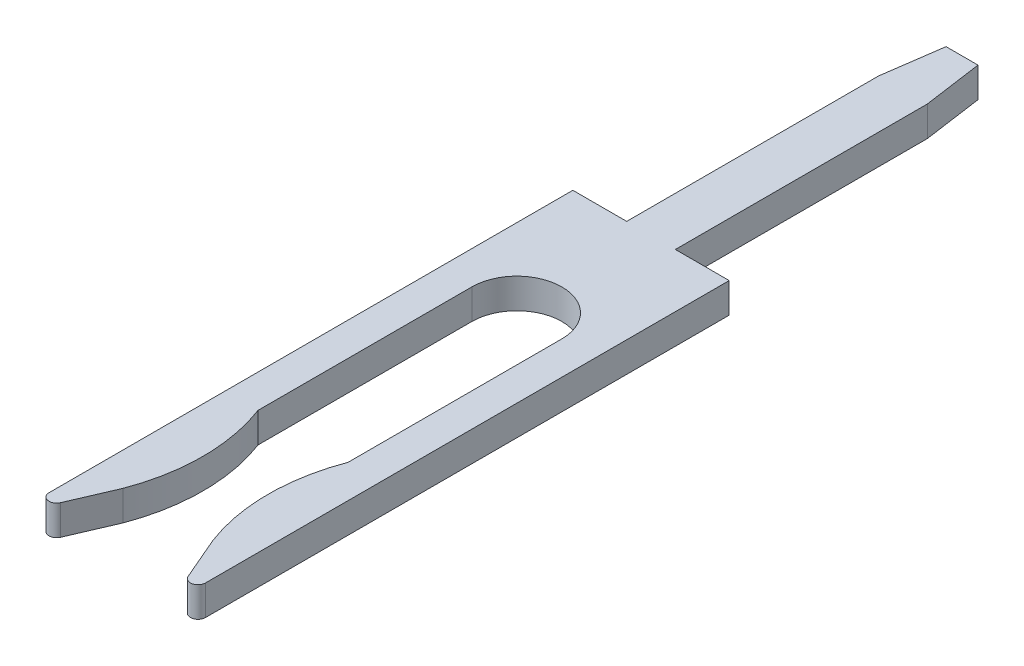
ISO-10303-21;
HEADER;
FILE_DESCRIPTION(('STEP AP214'),'2;1');
FILE_NAME('part.step','',(''),(''),'','','');
FILE_SCHEMA(('AUTOMOTIVE_DESIGN { 1 0 10303 214 1 1 1 1 }'));
ENDSEC;
DATA;
#1=APPLICATION_CONTEXT('core data for automotive mechanical design processes');
#2=APPLICATION_PROTOCOL_DEFINITION('international standard','automotive_design',2000,#1);
#3=PRODUCT_CONTEXT('',#1,'mechanical');
#4=PRODUCT('Part','Part','',(#3));
#5=PRODUCT_RELATED_PRODUCT_CATEGORY('part','',(#4));
#6=PRODUCT_DEFINITION_FORMATION('','',#4);
#7=PRODUCT_DEFINITION_CONTEXT('part definition',#1,'design');
#8=PRODUCT_DEFINITION('design','',#6,#7);
#9=PRODUCT_DEFINITION_SHAPE('','',#8);
#10=(LENGTH_UNIT() NAMED_UNIT(*) SI_UNIT(.MILLI.,.METRE.));
#11=(NAMED_UNIT(*) PLANE_ANGLE_UNIT() SI_UNIT($,.RADIAN.));
#12=(NAMED_UNIT(*) SI_UNIT($,.STERADIAN.) SOLID_ANGLE_UNIT());
#13=UNCERTAINTY_MEASURE_WITH_UNIT(LENGTH_MEASURE(1.E-05),#10,'distance_accuracy_value','');
#14=(GEOMETRIC_REPRESENTATION_CONTEXT(3) GLOBAL_UNCERTAINTY_ASSIGNED_CONTEXT((#13)) GLOBAL_UNIT_ASSIGNED_CONTEXT((#10,
#11,#12)) REPRESENTATION_CONTEXT('',''));
#15=CARTESIAN_POINT('',(0.,0.,0.));
#16=DIRECTION('',(0.,0.,1.));
#17=DIRECTION('',(1.,0.,0.));
#18=AXIS2_PLACEMENT_3D('',#15,#16,#17);
#19=CARTESIAN_POINT('',(25.07599652433,25.28989998217,6.080777376405));
#20=DIRECTION('',(-1.,-1.19248806385E-08,0.));
#21=DIRECTION('',(-1.19248806385E-08,1.,0.));
#22=AXIS2_PLACEMENT_3D('',#19,#20,#21);
#23=PLANE('',#22);
#24=DIRECTION('',(1.19499143889812E-08,-1.,4.37363856211066E-08));
#25=VECTOR('',#24,1.);
#26=CARTESIAN_POINT('',(25.07599652434,25.28990013485,9.573270968314));
#27=LINE('',#26,#25);
#28=CARTESIAN_POINT('',(25.07599652433,25.28990013484,9.573270968304));
#29=VERTEX_POINT('',#28);
#30=CARTESIAN_POINT('',(25.0759965291,24.88990013484,9.573270985789));
#31=VERTEX_POINT('',#30);
#32=EDGE_CURVE('E40',#29,#31,#27,.T.);
#33=ORIENTED_EDGE('',*,*,#32,.F.);
#34=DIRECTION('',(0.,-4.37128426212911E-08,-1.));
#35=VECTOR('',#34,1.);
#36=CARTESIAN_POINT('',(25.07599652434,25.28990013485,9.573270968314));
#37=LINE('',#36,#35);
#38=CARTESIAN_POINT('',(25.07599652433,25.28989982951,2.588283784507));
#39=VERTEX_POINT('',#38);
#40=EDGE_CURVE('E11',#29,#39,#37,.T.);
#41=ORIENTED_EDGE('',*,*,#40,.T.);
#42=DIRECTION('',(-1.19499143889812E-08,1.,-4.37364056051265E-08));
#43=VECTOR('',#42,1.);
#44=CARTESIAN_POINT('',(25.07599652911,24.88989982952,2.588283802001));
#45=LINE('',#44,#43);
#46=CARTESIAN_POINT('',(25.0759965291,24.88989982951,2.588283801991));
#47=VERTEX_POINT('',#46);
#48=EDGE_CURVE('E221',#47,#39,#45,.T.);
#49=ORIENTED_EDGE('',*,*,#48,.F.);
#50=DIRECTION('',(0.,-4.37128426212911E-08,-1.));
#51=VECTOR('',#50,1.);
#52=CARTESIAN_POINT('',(25.07599652911,24.88990013485,9.573270985799));
#53=LINE('',#52,#51);
#54=EDGE_CURVE('E278',#31,#47,#53,.T.);
#55=ORIENTED_EDGE('',*,*,#54,.F.);
#56=EDGE_LOOP('',(#33,#41,#49,#55));
#57=FACE_BOUND('',#56,.T.);
#58=ADVANCED_FACE('F17',(#57),#23,.T.);
#59=CARTESIAN_POINT('',(26.11879998724,24.88989981555,1.984306391413));
#60=DIRECTION('',(1.19248806385E-08,-1.,4.371140955657E-08));
#61=DIRECTION('',(-1.,-1.19248806385E-08,0.));
#62=AXIS2_PLACEMENT_3D('',#59,#60,#61);
#63=PLANE('',#62);
#64=DIRECTION('',(1.,1.19387949569543E-08,0.));
#65=VECTOR('',#64,1.);
#66=CARTESIAN_POINT('',(25.07599652911,24.88989982952,2.588283802001));
#67=LINE('',#66,#65);
#68=CARTESIAN_POINT('',(25.7943303603,24.88989983808,2.588283801991));
#69=VERTEX_POINT('',#68);
#70=EDGE_CURVE('E28',#47,#69,#67,.T.);
#71=ORIENTED_EDGE('',*,*,#70,.T.);
#72=DIRECTION('',(0.,-4.37143894959307E-08,-1.));
#73=VECTOR('',#72,1.);
#74=CARTESIAN_POINT('',(25.79433036031,24.88989983809,2.588283802001));
#75=LINE('',#74,#73);
#76=CARTESIAN_POINT('',(25.7943303603,24.88989969122,-0.7713859140081));
#77=VERTEX_POINT('',#76);
#78=EDGE_CURVE('E315',#69,#77,#75,.T.);
#79=ORIENTED_EDGE('',*,*,#78,.T.);
#80=DIRECTION('',(0.140037219781573,-4.16233468669388E-08,-0.990146240247291));
#81=VECTOR('',#80,1.);
#82=CARTESIAN_POINT('',(25.79433036031,24.88989969123,-0.7713859140181));
#83=LINE('',#82,#81);
#84=CARTESIAN_POINT('',(25.90579998724,24.8898996581,-1.559542321246));
#85=VERTEX_POINT('',#84);
#86=EDGE_CURVE('E319',#77,#85,#83,.T.);
#87=ORIENTED_EDGE('',*,*,#86,.T.);
#88=DIRECTION('',(1.,1.19483577939033E-08,0.));
#89=VECTOR('',#88,1.);
#90=CARTESIAN_POINT('',(25.90579998725,24.88989965811,-1.559542321256));
#91=LINE('',#90,#89);
#92=CARTESIAN_POINT('',(26.33179998724,24.88989966318,-1.559542321246));
#93=VERTEX_POINT('',#92);
#94=EDGE_CURVE('E327',#85,#93,#91,.T.);
#95=ORIENTED_EDGE('',*,*,#94,.T.);
#96=DIRECTION('',(0.140037219781671,4.49631833702907E-08,0.990146240247277));
#97=VECTOR('',#96,1.);
#98=CARTESIAN_POINT('',(26.33179998725,24.88989966319,-1.559542321256));
#99=LINE('',#98,#97);
#100=CARTESIAN_POINT('',(26.44326961418,24.88989969896,-0.7713859140083));
#101=VERTEX_POINT('',#100);
#102=EDGE_CURVE('E240',#93,#101,#99,.T.);
#103=ORIENTED_EDGE('',*,*,#102,.T.);
#104=DIRECTION('',(0.,4.37143916108408E-08,1.));
#105=VECTOR('',#104,1.);
#106=CARTESIAN_POINT('',(26.44326961419,24.88989969897,-0.7713859140183));
#107=LINE('',#106,#105);
#108=CARTESIAN_POINT('',(26.44326961418,24.88989984582,2.588283801991));
#109=VERTEX_POINT('',#108);
#110=EDGE_CURVE('E236',#101,#109,#107,.T.);
#111=ORIENTED_EDGE('',*,*,#110,.T.);
#112=DIRECTION('',(1.,1.19388147400343E-08,0.));
#113=VECTOR('',#112,1.);
#114=CARTESIAN_POINT('',(26.44326961419,24.88989984583,2.588283802001));
#115=LINE('',#114,#113);
#116=CARTESIAN_POINT('',(27.16160344538,24.88989985438,2.588283801991));
#117=VERTEX_POINT('',#116);
#118=EDGE_CURVE('E209',#109,#117,#115,.T.);
#119=ORIENTED_EDGE('',*,*,#118,.T.);
#120=DIRECTION('',(0.,4.37128385523211E-08,1.));
#121=VECTOR('',#120,1.);
#122=CARTESIAN_POINT('',(27.16160344539,24.88989985439,2.588283802001));
#123=LINE('',#122,#121);
#124=CARTESIAN_POINT('',(27.16160344538,24.88990015971,9.573270985789));
#125=VERTEX_POINT('',#124);
#126=EDGE_CURVE('E205',#117,#125,#123,.T.);
#127=ORIENTED_EDGE('',*,*,#126,.T.);
#128=CARTESIAN_POINT('',(27.06160344539,24.88990015852,9.573270985799));
#129=DIRECTION('',(1.20248966201232E-08,-1.,4.38114095533913E-08));
#130=DIRECTION('',(1.,1.20248966245075E-08,1.00071054263569E-10));
#131=AXIS2_PLACEMENT_3D('',#128,#129,#130);
#132=CIRCLE('',#131,0.10000000001);
#133=CARTESIAN_POINT('',(26.96975880725,24.88990015915,9.612825536045));
#134=VERTEX_POINT('',#133);
#135=EDGE_CURVE('E210',#125,#134,#132,.T.);
#136=ORIENTED_EDGE('',*,*,#135,.T.);
#137=DIRECTION('',(-0.395545502570568,-4.48791955093043E-08,-0.918446381339811));
#138=VECTOR('',#137,1.);
#139=CARTESIAN_POINT('',(26.96975880726,24.88990015916,9.612825536055));
#140=LINE('',#139,#138);
#141=CARTESIAN_POINT('',(26.71911315898,24.88990013072,9.03083285213));
#142=VERTEX_POINT('',#141);
#143=EDGE_CURVE('E251',#134,#142,#140,.T.);
#144=ORIENTED_EDGE('',*,*,#143,.T.);
#145=CARTESIAN_POINT('',(29.10159490395,24.88990011976,8.129959697596));
#146=DIRECTION('',(1.19225969347574E-08,-1.,4.37164703831067E-08));
#147=DIRECTION('',(-0.935365037457716,4.30982804777045E-09,0.353683823070445));
#148=AXIS2_PLACEMENT_3D('',#145,#146,#147);
#149=CIRCLE('',#148,2.54711438802489);
#150=CARTESIAN_POINT('',(26.71911315898,24.88990005196,7.229086543042));
#151=VERTEX_POINT('',#150);
#152=EDGE_CURVE('E247',#142,#151,#149,.T.);
#153=ORIENTED_EDGE('',*,*,#152,.T.);
#154=DIRECTION('',(0.,-4.371491727807E-08,-1.));
#155=VECTOR('',#154,1.);
#156=CARTESIAN_POINT('',(26.71911315899,24.88990005197,7.229086543052));
#157=LINE('',#156,#155);
#158=CARTESIAN_POINT('',(26.71911315898,24.88989992732,4.377666423637));
#159=VERTEX_POINT('',#158);
#160=EDGE_CURVE('E252',#151,#159,#157,.T.);
#161=ORIENTED_EDGE('',*,*,#160,.T.);
#162=CARTESIAN_POINT('',(26.11879998725,24.88989992017,4.377666423647));
#163=DIRECTION('',(-1.19415357801803E-08,1.,-4.37280675276324E-08));
#164=DIRECTION('',(1.,1.19415357794208E-08,-1.73681440488589E-11));
#165=AXIS2_PLACEMENT_3D('',#162,#163,#164);
#166=CIRCLE('',#165,0.6003131717543);
#167=CARTESIAN_POINT('',(25.5184868155,24.88989991301,4.377666423637));
#168=VERTEX_POINT('',#167);
#169=EDGE_CURVE('E181',#159,#168,#166,.T.);
#170=ORIENTED_EDGE('',*,*,#169,.T.);
#171=DIRECTION('',(0.,4.371492226186E-08,1.));
#172=VECTOR('',#171,1.);
#173=CARTESIAN_POINT('',(25.51848681551,24.88989991302,4.377666423647));
#174=LINE('',#173,#172);
#175=CARTESIAN_POINT('',(25.5184868155,24.88990003765,7.229086543042));
#176=VERTEX_POINT('',#175);
#177=EDGE_CURVE('E161',#168,#176,#174,.T.);
#178=ORIENTED_EDGE('',*,*,#177,.T.);
#179=CARTESIAN_POINT('',(23.13600507055,24.88990004862,8.129959697596));
#180=DIRECTION('',(1.19225969347481E-08,-1.,4.37164703831103E-08));
#181=DIRECTION('',(0.935365037457795,-4.30982804777035E-09,-0.353683823070237));
#182=AXIS2_PLACEMENT_3D('',#179,#180,#181);
#183=CIRCLE('',#182,2.54711438802489);
#184=CARTESIAN_POINT('',(25.5184868155,24.8899001164,9.03083285213));
#185=VERTEX_POINT('',#184);
#186=EDGE_CURVE('E168',#176,#185,#183,.T.);
#187=ORIENTED_EDGE('',*,*,#186,.T.);
#188=DIRECTION('',(-0.395545502570568,3.54455188138302E-08,0.918446381339812));
#189=VECTOR('',#188,1.);
#190=CARTESIAN_POINT('',(25.51848681551,24.88990011641,9.03083285214));
#191=LINE('',#190,#189);
#192=CARTESIAN_POINT('',(25.26784116723,24.88990013885,9.612825536045));
#193=VERTEX_POINT('',#192);
#194=EDGE_CURVE('E176',#185,#193,#191,.T.);
#195=ORIENTED_EDGE('',*,*,#194,.T.);
#196=CARTESIAN_POINT('',(25.17599652911,24.88990013604,9.573270985799));
#197=DIRECTION('',(1.19771811966332E-08,-1.,4.38428132506953E-08));
#198=DIRECTION('',(0.918446381322305,2.83422263316255E-08,0.395545502611221));
#199=AXIS2_PLACEMENT_3D('',#196,#197,#198);
#200=CIRCLE('',#199,0.10000000001314);
#201=EDGE_CURVE('E282',#193,#31,#200,.T.);
#202=ORIENTED_EDGE('',*,*,#201,.T.);
#203=ORIENTED_EDGE('',*,*,#54,.T.);
#204=EDGE_LOOP('',(#71,#79,#87,#95,#103,#111,#119,#127,#136,#144,#153,#161,#170,#178,#187,#195,
#202,#203));
#205=FACE_BOUND('',#204,.T.);
#206=ADVANCED_FACE('F179',(#205),#63,.T.);
#207=CARTESIAN_POINT('',(25.17599652433,25.28990013603,9.573270968304));
#208=DIRECTION('',(1.19248806385E-08,-1.,4.371140955657E-08));
#209=DIRECTION('',(1.,1.19248806385E-08,0.));
#210=AXIS2_PLACEMENT_3D('',#207,#208,#209);
#211=CYLINDRICAL_SURFACE('',#210,0.1);
#212=DIRECTION('',(-1.19499232707712E-08,1.,-4.37364078255666E-08));
#213=VECTOR('',#212,1.);
#214=CARTESIAN_POINT('',(25.26784116724,24.88990013886,9.612825536055));
#215=LINE('',#214,#213);
#216=CARTESIAN_POINT('',(25.26784116246,25.28990013885,9.612825518561));
#217=VERTEX_POINT('',#216);
#218=EDGE_CURVE('E283',#193,#217,#215,.T.);
#219=ORIENTED_EDGE('',*,*,#218,.T.);
#220=CARTESIAN_POINT('',(25.17599652434,25.28990013604,9.573270968314));
#221=DIRECTION('',(-1.20248966288933E-08,1.,-4.38114095509863E-08));
#222=DIRECTION('',(-1.,-1.20248966245075E-08,1.00106581400353E-10));
#223=AXIS2_PLACEMENT_3D('',#220,#221,#222);
#224=CIRCLE('',#223,0.10000000001);
#225=EDGE_CURVE('E201',#29,#217,#224,.T.);
#226=ORIENTED_EDGE('',*,*,#225,.F.);
#227=ORIENTED_EDGE('',*,*,#32,.T.);
#228=ORIENTED_EDGE('',*,*,#201,.F.);
#229=EDGE_LOOP('',(#219,#226,#227,#228));
#230=FACE_BOUND('',#229,.T.);
#231=ADVANCED_FACE('F442',(#230),#211,.T.);
#232=CARTESIAN_POINT('',(26.11879998247,25.28989981555,1.984306373928));
#233=DIRECTION('',(1.19248806385E-08,-1.,4.371140955657E-08));
#234=DIRECTION('',(-1.,-1.19248806385E-08,0.));
#235=AXIS2_PLACEMENT_3D('',#232,#233,#234);
#236=PLANE('',#235);
#237=ORIENTED_EDGE('',*,*,#40,.F.);
#238=ORIENTED_EDGE('',*,*,#225,.T.);
#239=DIRECTION('',(0.395545502570568,-3.54455244203702E-08,-0.918446381339812));
#240=VECTOR('',#239,1.);
#241=CARTESIAN_POINT('',(25.26784116247,25.28990013886,9.612825518571));
#242=LINE('',#241,#240);
#243=CARTESIAN_POINT('',(25.51848681073,25.2899001164,9.030832834645));
#244=VERTEX_POINT('',#243);
#245=EDGE_CURVE('E204',#217,#244,#242,.T.);
#246=ORIENTED_EDGE('',*,*,#245,.T.);
#247=CARTESIAN_POINT('',(23.13600506578,25.28990004862,8.129959680111));
#248=DIRECTION('',(-1.19271638080785E-08,1.,-4.37164701812266E-08));
#249=DIRECTION('',(0.935365037457827,2.66180603269375E-08,0.35368382307015));
#250=AXIS2_PLACEMENT_3D('',#247,#248,#249);
#251=CIRCLE('',#250,2.54711438802489);
#252=CARTESIAN_POINT('',(25.51848681073,25.28990003765,7.229086525558));
#253=VERTEX_POINT('',#252);
#254=EDGE_CURVE('E215',#244,#253,#251,.T.);
#255=ORIENTED_EDGE('',*,*,#254,.T.);
#256=DIRECTION('',(0.,4.371492226185E-08,1.));
#257=VECTOR('',#256,1.);
#258=CARTESIAN_POINT('',(25.51848681074,25.28989991302,4.377666406163));
#259=LINE('',#258,#257);
#260=CARTESIAN_POINT('',(25.51848681073,25.28989991301,4.377666406153));
#261=VERTEX_POINT('',#260);
#262=EDGE_CURVE('E187',#261,#253,#259,.T.);
#263=ORIENTED_EDGE('',*,*,#262,.F.);
#264=CARTESIAN_POINT('',(26.11879998248,25.28989992017,4.377666406163));
#265=DIRECTION('',(1.19415357786599E-08,-1.,4.37280675280302E-08));
#266=DIRECTION('',(-1.,-1.19415357794208E-08,-1.74006936015804E-11));
#267=AXIS2_PLACEMENT_3D('',#264,#265,#266);
#268=CIRCLE('',#267,0.6003131717543);
#269=CARTESIAN_POINT('',(26.71911315421,25.28989992732,4.377666406153));
#270=VERTEX_POINT('',#269);
#271=EDGE_CURVE('E211',#261,#270,#268,.T.);
#272=ORIENTED_EDGE('',*,*,#271,.T.);
#273=DIRECTION('',(0.,-4.371491603213E-08,-1.));
#274=VECTOR('',#273,1.);
#275=CARTESIAN_POINT('',(26.71911315422,25.28990005197,7.229086525567));
#276=LINE('',#275,#274);
#277=CARTESIAN_POINT('',(26.71911315421,25.28990005196,7.229086525557));
#278=VERTEX_POINT('',#277);
#279=EDGE_CURVE('E256',#278,#270,#276,.T.);
#280=ORIENTED_EDGE('',*,*,#279,.F.);
#281=CARTESIAN_POINT('',(29.10159489918,25.28990011976,8.129959680111));
#282=DIRECTION('',(-1.19271638080703E-08,1.,-4.37164701812235E-08));
#283=DIRECTION('',(-0.935365037457761,-2.66180603269356E-08,-0.353683823070325));
#284=AXIS2_PLACEMENT_3D('',#281,#282,#283);
#285=CIRCLE('',#284,2.54711438802489);
#286=CARTESIAN_POINT('',(26.71911315421,25.28990013072,9.030832834645));
#287=VERTEX_POINT('',#286);
#288=EDGE_CURVE('E216',#278,#287,#285,.T.);
#289=ORIENTED_EDGE('',*,*,#288,.T.);
#290=DIRECTION('',(0.395545502570568,4.48791842961643E-08,0.918446381339811));
#291=VECTOR('',#290,1.);
#292=CARTESIAN_POINT('',(26.71911315422,25.28990013073,9.030832834655));
#293=LINE('',#292,#291);
#294=CARTESIAN_POINT('',(26.96975880248,25.28990015915,9.612825518561));
#295=VERTEX_POINT('',#294);
#296=EDGE_CURVE('E220',#287,#295,#293,.T.);
#297=ORIENTED_EDGE('',*,*,#296,.T.);
#298=CARTESIAN_POINT('',(27.06160344062,25.28990015852,9.573270968314));
#299=DIRECTION('',(-1.18726045316643E-08,1.,-4.38428027177064E-08));
#300=DIRECTION('',(-0.918446381321739,6.43747276794627E-09,0.395545502612535));
#301=AXIS2_PLACEMENT_3D('',#298,#299,#300);
#302=CIRCLE('',#301,0.10000000001314);
#303=CARTESIAN_POINT('',(27.16160344061,25.28990015971,9.573270968304));
#304=VERTEX_POINT('',#303);
#305=EDGE_CURVE('E229',#295,#304,#302,.T.);
#306=ORIENTED_EDGE('',*,*,#305,.T.);
#307=DIRECTION('',(0.,4.37128380437011E-08,1.));
#308=VECTOR('',#307,1.);
#309=CARTESIAN_POINT('',(27.16160344062,25.28989985439,2.588283784517));
#310=LINE('',#309,#308);
#311=CARTESIAN_POINT('',(27.16160344061,25.28989985438,2.588283784507));
#312=VERTEX_POINT('',#311);
#313=EDGE_CURVE('E230',#312,#304,#310,.T.);
#314=ORIENTED_EDGE('',*,*,#313,.F.);
#315=DIRECTION('',(1.,1.19388048484943E-08,0.));
#316=VECTOR('',#315,1.);
#317=CARTESIAN_POINT('',(26.44326960942,25.28989984583,2.588283784517));
#318=LINE('',#317,#316);
#319=CARTESIAN_POINT('',(26.44326960941,25.28989984582,2.588283784507));
#320=VERTEX_POINT('',#319);
#321=EDGE_CURVE('E323',#320,#312,#318,.T.);
#322=ORIENTED_EDGE('',*,*,#321,.F.);
#323=DIRECTION('',(0.,4.37143926683008E-08,1.));
#324=VECTOR('',#323,1.);
#325=CARTESIAN_POINT('',(26.44326960942,25.28989969897,-0.7713859315028));
#326=LINE('',#325,#324);
#327=CARTESIAN_POINT('',(26.44326960941,25.28989969896,-0.7713859314928));
#328=VERTEX_POINT('',#327);
#329=EDGE_CURVE('E273',#328,#320,#326,.T.);
#330=ORIENTED_EDGE('',*,*,#329,.F.);
#331=DIRECTION('',(-0.140037219781671,-4.49631878335007E-08,-0.990146240247277));
#332=VECTOR('',#331,1.);
#333=CARTESIAN_POINT('',(26.44326960942,25.28989969897,-0.7713859315028));
#334=LINE('',#333,#332);
#335=CARTESIAN_POINT('',(26.33179998247,25.28989966318,-1.559542338731));
#336=VERTEX_POINT('',#335);
#337=EDGE_CURVE('E289',#328,#336,#334,.T.);
#338=ORIENTED_EDGE('',*,*,#337,.T.);
#339=DIRECTION('',(1.,1.19483577939033E-08,0.));
#340=VECTOR('',#339,1.);
#341=CARTESIAN_POINT('',(25.90579998248,25.28989965811,-1.559542338741));
#342=LINE('',#341,#340);
#343=CARTESIAN_POINT('',(25.90579998247,25.2898996581,-1.559542338731));
#344=VERTEX_POINT('',#343);
#345=EDGE_CURVE('E245',#344,#336,#342,.T.);
#346=ORIENTED_EDGE('',*,*,#345,.F.);
#347=DIRECTION('',(-0.140037219781573,4.16233602565788E-08,0.990146240247291));
#348=VECTOR('',#347,1.);
#349=CARTESIAN_POINT('',(25.90579998248,25.28989965811,-1.559542338741));
#350=LINE('',#349,#348);
#351=CARTESIAN_POINT('',(25.79433035553,25.28989969122,-0.771385931493));
#352=VERTEX_POINT('',#351);
#353=EDGE_CURVE('E224',#344,#352,#350,.T.);
#354=ORIENTED_EDGE('',*,*,#353,.T.);
#355=DIRECTION('',(0.,-4.37143894959208E-08,-1.));
#356=VECTOR('',#355,1.);
#357=CARTESIAN_POINT('',(25.79433035554,25.28989983809,2.588283784517));
#358=LINE('',#357,#356);
#359=CARTESIAN_POINT('',(25.79433035553,25.28989983808,2.588283784507));
#360=VERTEX_POINT('',#359);
#361=EDGE_CURVE('E356',#360,#352,#358,.T.);
#362=ORIENTED_EDGE('',*,*,#361,.F.);
#363=DIRECTION('',(1.,1.19388048484943E-08,0.));
#364=VECTOR('',#363,1.);
#365=CARTESIAN_POINT('',(25.07599652434,25.28989982952,2.588283784517));
#366=LINE('',#365,#364);
#367=EDGE_CURVE('E225',#39,#360,#366,.T.);
#368=ORIENTED_EDGE('',*,*,#367,.F.);
#369=EDGE_LOOP('',(#237,#238,#246,#255,#263,#272,#280,#289,#297,#306,#314,#322,#330,#338,#346,
#354,#362,#368));
#370=FACE_BOUND('',#369,.T.);
#371=ADVANCED_FACE('F397',(#370),#236,.F.);
#372=CARTESIAN_POINT('',(25.43516343993,25.2898998338,2.588283784507));
#373=DIRECTION('',(0.,-4.371140955657E-08,-1.));
#374=DIRECTION('',(0.,-1.,4.371140955657E-08));
#375=AXIS2_PLACEMENT_3D('',#372,#373,#374);
#376=PLANE('',#375);
#377=ORIENTED_EDGE('',*,*,#48,.T.);
#378=ORIENTED_EDGE('',*,*,#367,.T.);
#379=DIRECTION('',(-1.19498433347112E-08,1.,-4.37364056051265E-08));
#380=VECTOR('',#379,1.);
#381=CARTESIAN_POINT('',(25.79433036031,24.88989983809,2.588283802001));
#382=LINE('',#381,#380);
#383=EDGE_CURVE('E355',#69,#360,#382,.T.);
#384=ORIENTED_EDGE('',*,*,#383,.F.);
#385=ORIENTED_EDGE('',*,*,#70,.F.);
#386=EDGE_LOOP('',(#377,#378,#384,#385));
#387=FACE_BOUND('',#386,.T.);
#388=ADVANCED_FACE('F444',(#387),#376,.T.);
#389=CARTESIAN_POINT('',(25.79433035553,25.28989960729,-2.691551073493));
#390=DIRECTION('',(-1.,-1.19248806385E-08,0.));
#391=DIRECTION('',(-1.19248806385E-08,1.,0.));
#392=AXIS2_PLACEMENT_3D('',#389,#390,#391);
#393=PLANE('',#392);
#394=ORIENTED_EDGE('',*,*,#383,.T.);
#395=ORIENTED_EDGE('',*,*,#361,.T.);
#396=DIRECTION('',(-1.19498255711412E-08,1.,-4.37370284402366E-08));
#397=VECTOR('',#396,1.);
#398=CARTESIAN_POINT('',(25.79433036031,24.88989969123,-0.7713859140181));
#399=LINE('',#398,#397);
#400=EDGE_CURVE('E199',#77,#352,#399,.T.);
#401=ORIENTED_EDGE('',*,*,#400,.F.);
#402=ORIENTED_EDGE('',*,*,#78,.F.);
#403=EDGE_LOOP('',(#394,#395,#401,#402));
#404=FACE_BOUND('',#403,.T.);
#405=ADVANCED_FACE('F447',(#404),#393,.T.);
#406=CARTESIAN_POINT('',(25.850065169,25.28989967466,-1.165464135112));
#407=DIRECTION('',(-0.990146240248787,-1.79285999961997E-08,-0.140037219770998));
#408=DIRECTION('',(-0.140037219770998,0.,0.990146240248787));
#409=AXIS2_PLACEMENT_3D('',#406,#407,#408);
#410=PLANE('',#409);
#411=ORIENTED_EDGE('',*,*,#400,.T.);
#412=ORIENTED_EDGE('',*,*,#353,.F.);
#413=DIRECTION('',(-1.19499321525512E-08,1.,-4.37364144869066E-08));
#414=VECTOR('',#413,1.);
#415=CARTESIAN_POINT('',(25.90579998725,24.88989965811,-1.559542321256));
#416=LINE('',#415,#414);
#417=EDGE_CURVE('E352',#85,#344,#416,.T.);
#418=ORIENTED_EDGE('',*,*,#417,.F.);
#419=ORIENTED_EDGE('',*,*,#86,.F.);
#420=EDGE_LOOP('',(#411,#412,#418,#419));
#421=FACE_BOUND('',#420,.T.);
#422=ADVANCED_FACE('F452',(#421),#410,.T.);
#423=CARTESIAN_POINT('',(26.01229998247,25.28989965937,-1.559542338731));
#424=DIRECTION('',(0.,-4.371140955657E-08,-1.));
#425=DIRECTION('',(0.,-1.,4.371140955657E-08));
#426=AXIS2_PLACEMENT_3D('',#423,#424,#425);
#427=PLANE('',#426);
#428=ORIENTED_EDGE('',*,*,#417,.T.);
#429=ORIENTED_EDGE('',*,*,#345,.T.);
#430=DIRECTION('',(-1.19498433347112E-08,1.,-4.37364155971265E-08));
#431=VECTOR('',#430,1.);
#432=CARTESIAN_POINT('',(26.33179998725,24.88989966319,-1.559542321256));
#433=LINE('',#432,#431);
#434=EDGE_CURVE('E241',#93,#336,#433,.T.);
#435=ORIENTED_EDGE('',*,*,#434,.F.);
#436=ORIENTED_EDGE('',*,*,#94,.F.);
#437=EDGE_LOOP('',(#428,#429,#435,#436));
#438=FACE_BOUND('',#437,.T.);
#439=ADVANCED_FACE('F402',(#438),#427,.T.);
#440=CARTESIAN_POINT('',(26.38753479594,25.28989968107,-1.165464135112));
#441=DIRECTION('',(0.990146240248787,5.68615146305093E-09,-0.140037219770998));
#442=DIRECTION('',(0.,-1.,-4.06045726439688E-08));
#443=AXIS2_PLACEMENT_3D('',#440,#441,#442);
#444=PLANE('',#443);
#445=ORIENTED_EDGE('',*,*,#434,.T.);
#446=ORIENTED_EDGE('',*,*,#337,.F.);
#447=DIRECTION('',(-1.19498344529312E-08,1.,-4.37364097684565E-08));
#448=VECTOR('',#447,1.);
#449=CARTESIAN_POINT('',(26.44326961419,24.88989969897,-0.7713859140183));
#450=LINE('',#449,#448);
#451=EDGE_CURVE('E246',#101,#328,#450,.T.);
#452=ORIENTED_EDGE('',*,*,#451,.F.);
#453=ORIENTED_EDGE('',*,*,#102,.F.);
#454=EDGE_LOOP('',(#445,#446,#452,#453));
#455=FACE_BOUND('',#454,.T.);
#456=ADVANCED_FACE('F19',(#455),#444,.T.);
#457=CARTESIAN_POINT('',(26.44326960941,25.28989961503,-2.691551073493));
#458=DIRECTION('',(1.,1.19248806385E-08,0.));
#459=DIRECTION('',(0.,0.,-1.));
#460=AXIS2_PLACEMENT_3D('',#457,#458,#459);
#461=PLANE('',#460);
#462=ORIENTED_EDGE('',*,*,#451,.T.);
#463=ORIENTED_EDGE('',*,*,#329,.T.);
#464=DIRECTION('',(-1.19498255711412E-08,1.,-4.37364056051265E-08));
#465=VECTOR('',#464,1.);
#466=CARTESIAN_POINT('',(26.44326961419,24.88989984583,2.588283802001));
#467=LINE('',#466,#465);
#468=EDGE_CURVE('E293',#109,#320,#467,.T.);
#469=ORIENTED_EDGE('',*,*,#468,.F.);
#470=ORIENTED_EDGE('',*,*,#110,.F.);
#471=EDGE_LOOP('',(#462,#463,#469,#470));
#472=FACE_BOUND('',#471,.T.);
#473=ADVANCED_FACE('F393',(#472),#461,.T.);
#474=CARTESIAN_POINT('',(26.80243652501,25.2898998501,2.588283784507));
#475=DIRECTION('',(0.,-4.371140955657E-08,-1.));
#476=DIRECTION('',(0.,-1.,4.371140955657E-08));
#477=AXIS2_PLACEMENT_3D('',#474,#475,#476);
#478=PLANE('',#477);
#479=ORIENTED_EDGE('',*,*,#468,.T.);
#480=ORIENTED_EDGE('',*,*,#321,.T.);
#481=DIRECTION('',(-1.19498433347112E-08,1.,-4.37364067153465E-08));
#482=VECTOR('',#481,1.);
#483=CARTESIAN_POINT('',(27.16160344539,24.88989985439,2.588283802001));
#484=LINE('',#483,#482);
#485=EDGE_CURVE('E233',#117,#312,#484,.T.);
#486=ORIENTED_EDGE('',*,*,#485,.F.);
#487=ORIENTED_EDGE('',*,*,#118,.F.);
#488=EDGE_LOOP('',(#479,#480,#486,#487));
#489=FACE_BOUND('',#488,.T.);
#490=ADVANCED_FACE('F382',(#489),#478,.T.);
#491=CARTESIAN_POINT('',(27.16160344061,25.28990000705,6.080777376405));
#492=DIRECTION('',(1.,1.19248806385E-08,0.));
#493=DIRECTION('',(0.,0.,-1.));
#494=AXIS2_PLACEMENT_3D('',#491,#492,#493);
#495=PLANE('',#494);
#496=ORIENTED_EDGE('',*,*,#485,.T.);
#497=ORIENTED_EDGE('',*,*,#313,.T.);
#498=DIRECTION('',(-1.19498166893612E-08,1.,-4.37364211482466E-08));
#499=VECTOR('',#498,1.);
#500=CARTESIAN_POINT('',(27.16160344539,24.88990015972,9.573270985799));
#501=LINE('',#500,#499);
#502=EDGE_CURVE('E234',#125,#304,#501,.T.);
#503=ORIENTED_EDGE('',*,*,#502,.F.);
#504=ORIENTED_EDGE('',*,*,#126,.F.);
#505=EDGE_LOOP('',(#496,#497,#503,#504));
#506=FACE_BOUND('',#505,.T.);
#507=ADVANCED_FACE('F387',(#506),#495,.T.);
#508=CARTESIAN_POINT('',(27.06160344061,25.28990015851,9.573270968304));
#509=DIRECTION('',(1.19248806385E-08,-1.,4.371140955657E-08));
#510=DIRECTION('',(1.,1.19248806385E-08,0.));
#511=AXIS2_PLACEMENT_3D('',#508,#509,#510);
#512=CYLINDRICAL_SURFACE('',#511,0.1);
#513=ORIENTED_EDGE('',*,*,#502,.T.);
#514=ORIENTED_EDGE('',*,*,#305,.F.);
#515=DIRECTION('',(1.19498433347112E-08,-1.,4.37363945028965E-08));
#516=VECTOR('',#515,1.);
#517=CARTESIAN_POINT('',(26.96975880249,25.28990015916,9.612825518571));
#518=LINE('',#517,#516);
#519=EDGE_CURVE('E296',#295,#134,#518,.T.);
#520=ORIENTED_EDGE('',*,*,#519,.T.);
#521=ORIENTED_EDGE('',*,*,#135,.F.);
#522=EDGE_LOOP('',(#513,#514,#520,#521));
#523=FACE_BOUND('',#522,.T.);
#524=ADVANCED_FACE('F431',(#523),#512,.T.);
#525=CARTESIAN_POINT('',(26.84443597835,25.28990014493,9.321829176603));
#526=DIRECTION('',(-0.918446381343077,6.33748799040884E-09,0.39554550256299));
#527=DIRECTION('',(6.90022642491259E-09,1.,0.));
#528=AXIS2_PLACEMENT_3D('',#525,#526,#527);
#529=PLANE('',#528);
#530=ORIENTED_EDGE('',*,*,#519,.F.);
#531=ORIENTED_EDGE('',*,*,#296,.F.);
#532=DIRECTION('',(-1.19501097882412E-08,1.,-4.37370428731365E-08));
#533=VECTOR('',#532,1.);
#534=CARTESIAN_POINT('',(26.71911315899,24.88990013073,9.03083285214));
#535=LINE('',#534,#533);
#536=EDGE_CURVE('E297',#142,#287,#535,.T.);
#537=ORIENTED_EDGE('',*,*,#536,.F.);
#538=ORIENTED_EDGE('',*,*,#143,.F.);
#539=EDGE_LOOP('',(#530,#531,#537,#538));
#540=FACE_BOUND('',#539,.T.);
#541=ADVANCED_FACE('F422',(#540),#529,.T.);
#542=CARTESIAN_POINT('',(29.10159489917,25.28990011975,8.129959680101));
#543=DIRECTION('',(1.19248806385E-08,-1.,4.371140955657E-08));
#544=DIRECTION('',(1.,1.19248806385E-08,0.));
#545=AXIS2_PLACEMENT_3D('',#542,#543,#544);
#546=CYLINDRICAL_SURFACE('',#545,2.547114388012);
#547=ORIENTED_EDGE('',*,*,#536,.T.);
#548=ORIENTED_EDGE('',*,*,#288,.F.);
#549=DIRECTION('',(1.19498344529312E-08,-1.,4.37366742790966E-08));
#550=VECTOR('',#549,1.);
#551=CARTESIAN_POINT('',(26.71911315422,25.28990005197,7.229086525567));
#552=LINE('',#551,#550);
#553=EDGE_CURVE('E260',#278,#151,#552,.T.);
#554=ORIENTED_EDGE('',*,*,#553,.T.);
#555=ORIENTED_EDGE('',*,*,#152,.F.);
#556=EDGE_LOOP('',(#547,#548,#554,#555));
#557=FACE_BOUND('',#556,.T.);
#558=ADVANCED_FACE('F420',(#557),#546,.T.);
#559=CARTESIAN_POINT('',(26.71911315421,25.28989998964,5.803376465855));
#560=DIRECTION('',(-1.,-1.19248806385E-08,0.));
#561=DIRECTION('',(-1.19248806385E-08,1.,0.));
#562=AXIS2_PLACEMENT_3D('',#559,#560,#561);
#563=PLANE('',#562);
#564=ORIENTED_EDGE('',*,*,#553,.F.);
#565=ORIENTED_EDGE('',*,*,#279,.T.);
#566=DIRECTION('',(-1.19498344529312E-08,1.,-4.37356262285565E-08));
#567=VECTOR('',#566,1.);
#568=CARTESIAN_POINT('',(26.71911315899,24.88989992733,4.377666423647));
#569=LINE('',#568,#567);
#570=EDGE_CURVE('E261',#159,#270,#569,.T.);
#571=ORIENTED_EDGE('',*,*,#570,.F.);
#572=ORIENTED_EDGE('',*,*,#160,.F.);
#573=EDGE_LOOP('',(#564,#565,#571,#572));
#574=FACE_BOUND('',#573,.T.);
#575=ADVANCED_FACE('F415',(#574),#563,.T.);
#576=CARTESIAN_POINT('',(26.11879998247,25.28989992016,4.377666406153));
#577=DIRECTION('',(1.19248806385E-08,-1.,4.371140955657E-08));
#578=DIRECTION('',(1.,1.19248806385E-08,0.));
#579=AXIS2_PLACEMENT_3D('',#576,#577,#578);
#580=CYLINDRICAL_SURFACE('',#579,0.6003131717443);
#581=ORIENTED_EDGE('',*,*,#570,.T.);
#582=ORIENTED_EDGE('',*,*,#271,.F.);
#583=DIRECTION('',(1.19498433347112E-08,-1.,4.37371983043665E-08));
#584=VECTOR('',#583,1.);
#585=CARTESIAN_POINT('',(25.51848681074,25.28989991302,4.377666406163));
#586=LINE('',#585,#584);
#587=EDGE_CURVE('E192',#261,#168,#586,.T.);
#588=ORIENTED_EDGE('',*,*,#587,.T.);
#589=ORIENTED_EDGE('',*,*,#169,.F.);
#590=EDGE_LOOP('',(#581,#582,#588,#589));
#591=FACE_BOUND('',#590,.T.);
#592=ADVANCED_FACE('F418',(#591),#580,.F.);
#593=CARTESIAN_POINT('',(25.51848681073,25.28989997533,5.803376465855));
#594=DIRECTION('',(1.,1.19248806385E-08,0.));
#595=DIRECTION('',(0.,0.,-1.));
#596=AXIS2_PLACEMENT_3D('',#593,#594,#595);
#597=PLANE('',#596);
#598=ORIENTED_EDGE('',*,*,#587,.F.);
#599=ORIENTED_EDGE('',*,*,#262,.T.);
#600=DIRECTION('',(-1.19498344529312E-08,1.,-4.37364033846765E-08));
#601=VECTOR('',#600,1.);
#602=CARTESIAN_POINT('',(25.51848681551,24.88990003766,7.229086543052));
#603=LINE('',#602,#601);
#604=EDGE_CURVE('E21',#176,#253,#603,.T.);
#605=ORIENTED_EDGE('',*,*,#604,.F.);
#606=ORIENTED_EDGE('',*,*,#177,.F.);
#607=EDGE_LOOP('',(#598,#599,#605,#606));
#608=FACE_BOUND('',#607,.T.);
#609=ADVANCED_FACE('F186',(#608),#597,.T.);
#610=CARTESIAN_POINT('',(23.13600506577,25.28990004861,8.129959680101));
#611=DIRECTION('',(1.19248806385E-08,-1.,4.371140955657E-08));
#612=DIRECTION('',(1.,1.19248806385E-08,0.));
#613=AXIS2_PLACEMENT_3D('',#610,#611,#612);
#614=CYLINDRICAL_SURFACE('',#613,2.547114388012);
#615=ORIENTED_EDGE('',*,*,#186,.F.);
#616=ORIENTED_EDGE('',*,*,#604,.T.);
#617=ORIENTED_EDGE('',*,*,#254,.F.);
#618=DIRECTION('',(1.19496124083212E-08,-1.,4.37371139274165E-08));
#619=VECTOR('',#618,1.);
#620=CARTESIAN_POINT('',(25.51848681074,25.28990011641,9.030832834655));
#621=LINE('',#620,#619);
#622=EDGE_CURVE('E171',#244,#185,#621,.T.);
#623=ORIENTED_EDGE('',*,*,#622,.T.);
#624=EDGE_LOOP('',(#615,#616,#617,#623));
#625=FACE_BOUND('',#624,.T.);
#626=ADVANCED_FACE('F169',(#625),#614,.T.);
#627=CARTESIAN_POINT('',(25.39316398659,25.28990012763,9.321829176603));
#628=DIRECTION('',(0.918446381343076,2.82422149311693E-08,0.395545502562989));
#629=DIRECTION('',(0.,-1.,7.14006726107869E-08));
#630=AXIS2_PLACEMENT_3D('',#627,#628,#629);
#631=PLANE('',#630);
#632=ORIENTED_EDGE('',*,*,#622,.F.);
#633=ORIENTED_EDGE('',*,*,#245,.F.);
#634=ORIENTED_EDGE('',*,*,#218,.F.);
#635=ORIENTED_EDGE('',*,*,#194,.F.);
#636=EDGE_LOOP('',(#632,#633,#634,#635));
#637=FACE_BOUND('',#636,.T.);
#638=ADVANCED_FACE('F460',(#637),#631,.T.);
#639=CLOSED_SHELL('',(#58,#206,#231,#371,#388,#405,#422,#439,#456,#473,#490,#507,#524,#541,#558,
#575,#592,#609,#626,#638));
#640=MANIFOLD_SOLID_BREP('B1',#639);
#641=ADVANCED_BREP_SHAPE_REPRESENTATION('',(#18,#640),#14);
#642=SHAPE_DEFINITION_REPRESENTATION(#9,#641);
ENDSEC;
END-ISO-10303-21;
